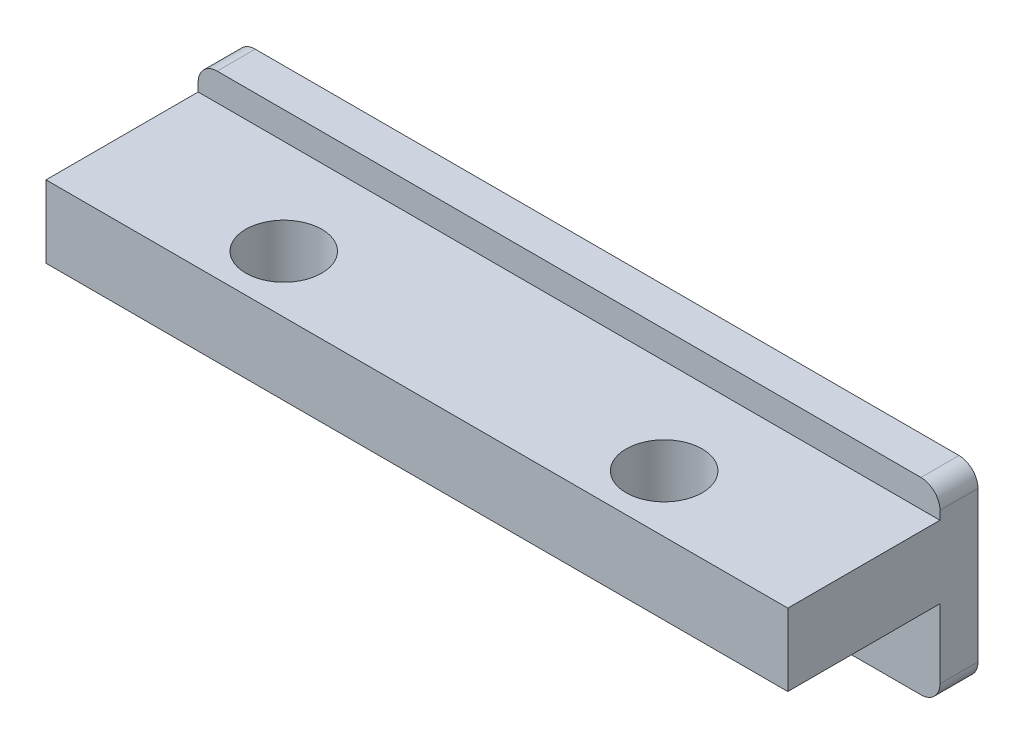
ISO-10303-21;
HEADER;
FILE_DESCRIPTION(('STEP AP214'),'2;1');
FILE_NAME('part.step','',(''),(''),'','','');
FILE_SCHEMA(('AUTOMOTIVE_DESIGN { 1 0 10303 214 1 1 1 1 }'));
ENDSEC;
DATA;
#1=APPLICATION_CONTEXT('core data for automotive mechanical design processes');
#2=APPLICATION_PROTOCOL_DEFINITION('international standard','automotive_design',2000,#1);
#3=PRODUCT_CONTEXT('',#1,'mechanical');
#4=PRODUCT('Part','Part','',(#3));
#5=PRODUCT_RELATED_PRODUCT_CATEGORY('part','',(#4));
#6=PRODUCT_DEFINITION_FORMATION('','',#4);
#7=PRODUCT_DEFINITION_CONTEXT('part definition',#1,'design');
#8=PRODUCT_DEFINITION('design','',#6,#7);
#9=PRODUCT_DEFINITION_SHAPE('','',#8);
#10=(LENGTH_UNIT() NAMED_UNIT(*) SI_UNIT(.MILLI.,.METRE.));
#11=(NAMED_UNIT(*) PLANE_ANGLE_UNIT() SI_UNIT($,.RADIAN.));
#12=(NAMED_UNIT(*) SI_UNIT($,.STERADIAN.) SOLID_ANGLE_UNIT());
#13=UNCERTAINTY_MEASURE_WITH_UNIT(LENGTH_MEASURE(1.E-05),#10,'distance_accuracy_value','');
#14=(GEOMETRIC_REPRESENTATION_CONTEXT(3) GLOBAL_UNCERTAINTY_ASSIGNED_CONTEXT((#13)) GLOBAL_UNIT_ASSIGNED_CONTEXT((#10,
#11,#12)) REPRESENTATION_CONTEXT('',''));
#15=CARTESIAN_POINT('',(0.,0.,0.));
#16=DIRECTION('',(0.,0.,1.));
#17=DIRECTION('',(1.,0.,0.));
#18=AXIS2_PLACEMENT_3D('',#15,#16,#17);
#19=CARTESIAN_POINT('',(0.,0.,2.));
#20=DIRECTION('',(0.,0.,1.));
#21=DIRECTION('',(1.,0.,0.));
#22=AXIS2_PLACEMENT_3D('',#19,#20,#21);
#23=PLANE('',#22);
#24=DIRECTION('',(0.,-1.,0.));
#25=VECTOR('',#24,1.);
#26=CARTESIAN_POINT('',(0.,0.,2.));
#27=LINE('',#26,#25);
#28=CARTESIAN_POINT('',(0.,1.64999999999999,2.));
#29=VERTEX_POINT('',#28);
#30=CARTESIAN_POINT('',(0.,-2.,2.));
#31=VERTEX_POINT('',#30);
#32=EDGE_CURVE('E210',#29,#31,#27,.T.);
#33=ORIENTED_EDGE('',*,*,#32,.T.);
#34=CARTESIAN_POINT('',(1.,-2.,2.));
#35=DIRECTION('',(0.,0.,1.));
#36=DIRECTION('',(1.,0.,0.));
#37=AXIS2_PLACEMENT_3D('',#34,#35,#36);
#38=CIRCLE('',#37,1.);
#39=CARTESIAN_POINT('',(1.,-3.,2.));
#40=VERTEX_POINT('',#39);
#41=EDGE_CURVE('E295',#31,#40,#38,.T.);
#42=ORIENTED_EDGE('',*,*,#41,.T.);
#43=DIRECTION('',(1.,0.,0.));
#44=VECTOR('',#43,1.);
#45=CARTESIAN_POINT('',(0.,-3.,2.));
#46=LINE('',#45,#44);
#47=CARTESIAN_POINT('',(9.,-3.,2.));
#48=VERTEX_POINT('',#47);
#49=EDGE_CURVE('E209',#40,#48,#46,.T.);
#50=ORIENTED_EDGE('',*,*,#49,.T.);
#51=CARTESIAN_POINT('',(9.,-2.,2.));
#52=DIRECTION('',(0.,0.,1.));
#53=DIRECTION('',(1.,0.,0.));
#54=AXIS2_PLACEMENT_3D('',#51,#52,#53);
#55=CIRCLE('',#54,1.);
#56=CARTESIAN_POINT('',(10.,-2.,2.));
#57=VERTEX_POINT('',#56);
#58=EDGE_CURVE('E293',#48,#57,#55,.T.);
#59=ORIENTED_EDGE('',*,*,#58,.T.);
#60=DIRECTION('',(0.,1.,0.));
#61=VECTOR('',#60,1.);
#62=CARTESIAN_POINT('',(10.,-3.,2.));
#63=LINE('',#62,#61);
#64=CARTESIAN_POINT('',(10.,-1.,2.));
#65=VERTEX_POINT('',#64);
#66=EDGE_CURVE('E213',#57,#65,#63,.T.);
#67=ORIENTED_EDGE('',*,*,#66,.T.);
#68=CARTESIAN_POINT('',(11.,-1.,2.));
#69=DIRECTION('',(0.,0.,1.));
#70=DIRECTION('',(1.,0.,0.));
#71=AXIS2_PLACEMENT_3D('',#68,#69,#70);
#72=CIRCLE('',#71,1.);
#73=CARTESIAN_POINT('',(11.,0.,2.));
#74=VERTEX_POINT('',#73);
#75=EDGE_CURVE('E318',#65,#74,#72,.F.);
#76=ORIENTED_EDGE('',*,*,#75,.T.);
#77=DIRECTION('',(1.,0.,0.));
#78=VECTOR('',#77,1.);
#79=CARTESIAN_POINT('',(10.,0.,2.));
#80=LINE('',#79,#78);
#81=CARTESIAN_POINT('',(28.,0.,2.));
#82=VERTEX_POINT('',#81);
#83=EDGE_CURVE('E216',#74,#82,#80,.T.);
#84=ORIENTED_EDGE('',*,*,#83,.T.);
#85=CARTESIAN_POINT('',(28.,-1.,2.));
#86=DIRECTION('',(0.,0.,1.));
#87=DIRECTION('',(1.,0.,0.));
#88=AXIS2_PLACEMENT_3D('',#85,#86,#87);
#89=CIRCLE('',#88,1.);
#90=CARTESIAN_POINT('',(29.,-1.,2.));
#91=VERTEX_POINT('',#90);
#92=EDGE_CURVE('E11',#82,#91,#89,.F.);
#93=ORIENTED_EDGE('',*,*,#92,.T.);
#94=DIRECTION('',(0.,-1.,0.));
#95=VECTOR('',#94,1.);
#96=CARTESIAN_POINT('',(29.,0.,2.));
#97=LINE('',#96,#95);
#98=CARTESIAN_POINT('',(29.,-2.,2.));
#99=VERTEX_POINT('',#98);
#100=EDGE_CURVE('E219',#91,#99,#97,.T.);
#101=ORIENTED_EDGE('',*,*,#100,.T.);
#102=CARTESIAN_POINT('',(30.,-2.,2.));
#103=DIRECTION('',(0.,0.,1.));
#104=DIRECTION('',(1.,0.,0.));
#105=AXIS2_PLACEMENT_3D('',#102,#103,#104);
#106=CIRCLE('',#105,1.);
#107=CARTESIAN_POINT('',(30.,-3.,2.));
#108=VERTEX_POINT('',#107);
#109=EDGE_CURVE('E55',#99,#108,#106,.T.);
#110=ORIENTED_EDGE('',*,*,#109,.T.);
#111=DIRECTION('',(1.,0.,0.));
#112=VECTOR('',#111,1.);
#113=CARTESIAN_POINT('',(29.,-3.,2.));
#114=LINE('',#113,#112);
#115=CARTESIAN_POINT('',(38.,-3.,2.));
#116=VERTEX_POINT('',#115);
#117=EDGE_CURVE('E221',#108,#116,#114,.T.);
#118=ORIENTED_EDGE('',*,*,#117,.T.);
#119=CARTESIAN_POINT('',(38.,-2.,2.));
#120=DIRECTION('',(0.,0.,1.));
#121=DIRECTION('',(1.,0.,0.));
#122=AXIS2_PLACEMENT_3D('',#119,#120,#121);
#123=CIRCLE('',#122,1.);
#124=CARTESIAN_POINT('',(39.,-2.,2.));
#125=VERTEX_POINT('',#124);
#126=EDGE_CURVE('E291',#116,#125,#123,.T.);
#127=ORIENTED_EDGE('',*,*,#126,.T.);
#128=DIRECTION('',(0.,1.,0.));
#129=VECTOR('',#128,1.);
#130=CARTESIAN_POINT('',(39.,-3.,2.));
#131=LINE('',#130,#129);
#132=CARTESIAN_POINT('',(39.,1.64999999999999,2.));
#133=VERTEX_POINT('',#132);
#134=EDGE_CURVE('E223',#125,#133,#131,.T.);
#135=ORIENTED_EDGE('',*,*,#134,.T.);
#136=DIRECTION('',(1.,0.,0.));
#137=VECTOR('',#136,1.);
#138=CARTESIAN_POINT('',(39.,1.65,2.));
#139=LINE('',#138,#137);
#140=EDGE_CURVE('E191',#29,#133,#139,.T.);
#141=ORIENTED_EDGE('',*,*,#140,.F.);
#142=EDGE_LOOP('',(#33,#42,#50,#59,#67,#76,#84,#93,#101,#110,#118,#127,#135,#141));
#143=FACE_BOUND('',#142,.T.);
#144=ADVANCED_FACE('F33',(#143),#23,.T.);
#145=CARTESIAN_POINT('',(0.,-3.,2.));
#146=DIRECTION('',(0.,1.,0.));
#147=DIRECTION('',(0.,0.,1.));
#148=AXIS2_PLACEMENT_3D('',#145,#146,#147);
#149=PLANE('',#148);
#150=ORIENTED_EDGE('',*,*,#49,.F.);
#151=DIRECTION('',(0.,0.,-1.));
#152=VECTOR('',#151,1.);
#153=CARTESIAN_POINT('',(1.,-3.,2.));
#154=LINE('',#153,#152);
#155=CARTESIAN_POINT('',(1.,-3.,0.));
#156=VERTEX_POINT('',#155);
#157=EDGE_CURVE('E287',#40,#156,#154,.T.);
#158=ORIENTED_EDGE('',*,*,#157,.T.);
#159=DIRECTION('',(1.,0.,0.));
#160=VECTOR('',#159,1.);
#161=CARTESIAN_POINT('',(0.,-3.,0.));
#162=LINE('',#161,#160);
#163=CARTESIAN_POINT('',(9.,-3.,0.));
#164=VERTEX_POINT('',#163);
#165=EDGE_CURVE('E198',#156,#164,#162,.T.);
#166=ORIENTED_EDGE('',*,*,#165,.T.);
#167=DIRECTION('',(0.,0.,-1.));
#168=VECTOR('',#167,1.);
#169=CARTESIAN_POINT('',(9.,-3.,2.));
#170=LINE('',#169,#168);
#171=EDGE_CURVE('E285',#164,#48,#170,.F.);
#172=ORIENTED_EDGE('',*,*,#171,.T.);
#173=EDGE_LOOP('',(#150,#158,#166,#172));
#174=FACE_BOUND('',#173,.T.);
#175=ADVANCED_FACE('F387',(#174),#149,.F.);
#176=CARTESIAN_POINT('',(10.,-3.,2.));
#177=DIRECTION('',(-1.,0.,0.));
#178=DIRECTION('',(0.,0.,1.));
#179=AXIS2_PLACEMENT_3D('',#176,#177,#178);
#180=PLANE('',#179);
#181=ORIENTED_EDGE('',*,*,#66,.F.);
#182=DIRECTION('',(0.,0.,-1.));
#183=VECTOR('',#182,1.);
#184=CARTESIAN_POINT('',(10.,-2.,2.));
#185=LINE('',#184,#183);
#186=CARTESIAN_POINT('',(10.,-2.,0.));
#187=VERTEX_POINT('',#186);
#188=EDGE_CURVE('E299',#57,#187,#185,.T.);
#189=ORIENTED_EDGE('',*,*,#188,.T.);
#190=DIRECTION('',(0.,1.,0.));
#191=VECTOR('',#190,1.);
#192=CARTESIAN_POINT('',(10.,-3.,0.));
#193=LINE('',#192,#191);
#194=CARTESIAN_POINT('',(10.,-1.,0.));
#195=VERTEX_POINT('',#194);
#196=EDGE_CURVE('E201',#187,#195,#193,.T.);
#197=ORIENTED_EDGE('',*,*,#196,.T.);
#198=DIRECTION('',(0.,0.,-1.));
#199=VECTOR('',#198,1.);
#200=CARTESIAN_POINT('',(10.,-1.,2.));
#201=LINE('',#200,#199);
#202=EDGE_CURVE('E297',#195,#65,#201,.F.);
#203=ORIENTED_EDGE('',*,*,#202,.T.);
#204=EDGE_LOOP('',(#181,#189,#197,#203));
#205=FACE_BOUND('',#204,.T.);
#206=ADVANCED_FACE('F393',(#205),#180,.F.);
#207=CARTESIAN_POINT('',(10.,0.,2.));
#208=DIRECTION('',(0.,1.,0.));
#209=DIRECTION('',(0.,0.,1.));
#210=AXIS2_PLACEMENT_3D('',#207,#208,#209);
#211=PLANE('',#210);
#212=ORIENTED_EDGE('',*,*,#83,.F.);
#213=DIRECTION('',(0.,0.,-1.));
#214=VECTOR('',#213,1.);
#215=CARTESIAN_POINT('',(11.,0.,0.));
#216=LINE('',#215,#214);
#217=CARTESIAN_POINT('',(11.,0.,0.));
#218=VERTEX_POINT('',#217);
#219=EDGE_CURVE('E304',#74,#218,#216,.T.);
#220=ORIENTED_EDGE('',*,*,#219,.T.);
#221=DIRECTION('',(1.,0.,0.));
#222=VECTOR('',#221,1.);
#223=CARTESIAN_POINT('',(10.,0.,0.));
#224=LINE('',#223,#222);
#225=CARTESIAN_POINT('',(28.,0.,0.));
#226=VERTEX_POINT('',#225);
#227=EDGE_CURVE('E231',#218,#226,#224,.T.);
#228=ORIENTED_EDGE('',*,*,#227,.T.);
#229=DIRECTION('',(0.,0.,-1.));
#230=VECTOR('',#229,1.);
#231=CARTESIAN_POINT('',(28.,0.,2.));
#232=LINE('',#231,#230);
#233=EDGE_CURVE('E302',#226,#82,#232,.F.);
#234=ORIENTED_EDGE('',*,*,#233,.T.);
#235=EDGE_LOOP('',(#212,#220,#228,#234));
#236=FACE_BOUND('',#235,.T.);
#237=ADVANCED_FACE('F329',(#236),#211,.F.);
#238=CARTESIAN_POINT('',(29.,0.,2.));
#239=DIRECTION('',(1.,0.,0.));
#240=DIRECTION('',(0.,0.,-1.));
#241=AXIS2_PLACEMENT_3D('',#238,#239,#240);
#242=PLANE('',#241);
#243=DIRECTION('',(0.,-1.,0.));
#244=VECTOR('',#243,1.);
#245=CARTESIAN_POINT('',(29.,0.,0.));
#246=LINE('',#245,#244);
#247=CARTESIAN_POINT('',(29.,-1.,0.));
#248=VERTEX_POINT('',#247);
#249=CARTESIAN_POINT('',(29.,-2.,0.));
#250=VERTEX_POINT('',#249);
#251=EDGE_CURVE('E234',#248,#250,#246,.T.);
#252=ORIENTED_EDGE('',*,*,#251,.T.);
#253=DIRECTION('',(0.,0.,-1.));
#254=VECTOR('',#253,1.);
#255=CARTESIAN_POINT('',(29.,-2.,2.));
#256=LINE('',#255,#254);
#257=EDGE_CURVE('E314',#250,#99,#256,.F.);
#258=ORIENTED_EDGE('',*,*,#257,.T.);
#259=ORIENTED_EDGE('',*,*,#100,.F.);
#260=DIRECTION('',(0.,0.,-1.));
#261=VECTOR('',#260,1.);
#262=CARTESIAN_POINT('',(29.,-1.,0.));
#263=LINE('',#262,#261);
#264=EDGE_CURVE('E311',#91,#248,#263,.T.);
#265=ORIENTED_EDGE('',*,*,#264,.T.);
#266=EDGE_LOOP('',(#252,#258,#259,#265));
#267=FACE_BOUND('',#266,.T.);
#268=ADVANCED_FACE('F335',(#267),#242,.F.);
#269=CARTESIAN_POINT('',(29.,-3.,2.));
#270=DIRECTION('',(0.,1.,0.));
#271=DIRECTION('',(0.,0.,1.));
#272=AXIS2_PLACEMENT_3D('',#269,#270,#271);
#273=PLANE('',#272);
#274=DIRECTION('',(1.,0.,0.));
#275=VECTOR('',#274,1.);
#276=CARTESIAN_POINT('',(29.,-3.,0.));
#277=LINE('',#276,#275);
#278=CARTESIAN_POINT('',(30.,-3.,0.));
#279=VERTEX_POINT('',#278);
#280=CARTESIAN_POINT('',(38.,-3.,0.));
#281=VERTEX_POINT('',#280);
#282=EDGE_CURVE('E237',#279,#281,#277,.T.);
#283=ORIENTED_EDGE('',*,*,#282,.T.);
#284=DIRECTION('',(0.,0.,-1.));
#285=VECTOR('',#284,1.);
#286=CARTESIAN_POINT('',(38.,-3.,2.));
#287=LINE('',#286,#285);
#288=EDGE_CURVE('E48',#281,#116,#287,.F.);
#289=ORIENTED_EDGE('',*,*,#288,.T.);
#290=ORIENTED_EDGE('',*,*,#117,.F.);
#291=DIRECTION('',(0.,0.,-1.));
#292=VECTOR('',#291,1.);
#293=CARTESIAN_POINT('',(30.,-3.,2.));
#294=LINE('',#293,#292);
#295=EDGE_CURVE('E307',#108,#279,#294,.T.);
#296=ORIENTED_EDGE('',*,*,#295,.T.);
#297=EDGE_LOOP('',(#283,#289,#290,#296));
#298=FACE_BOUND('',#297,.T.);
#299=ADVANCED_FACE('F341',(#298),#273,.F.);
#300=CARTESIAN_POINT('',(39.,0.,2.));
#301=DIRECTION('',(-1.,0.,0.));
#302=DIRECTION('',(0.,0.,1.));
#303=AXIS2_PLACEMENT_3D('',#300,#301,#302);
#304=PLANE('',#303);
#305=DIRECTION('',(0.,1.,0.));
#306=VECTOR('',#305,1.);
#307=CARTESIAN_POINT('',(39.,0.,0.));
#308=LINE('',#307,#306);
#309=CARTESIAN_POINT('',(39.,-2.,0.));
#310=VERTEX_POINT('',#309);
#311=CARTESIAN_POINT('',(39.,5.9,0.));
#312=VERTEX_POINT('',#311);
#313=EDGE_CURVE('E239',#310,#312,#308,.T.);
#314=ORIENTED_EDGE('',*,*,#313,.T.);
#315=DIRECTION('',(0.,0.,-1.));
#316=VECTOR('',#315,1.);
#317=CARTESIAN_POINT('',(39.,5.9,2.));
#318=LINE('',#317,#316);
#319=CARTESIAN_POINT('',(39.,5.9,2.));
#320=VERTEX_POINT('',#319);
#321=EDGE_CURVE('E274',#312,#320,#318,.F.);
#322=ORIENTED_EDGE('',*,*,#321,.T.);
#323=CARTESIAN_POINT('',(39.,5.45,2.));
#324=VERTEX_POINT('',#323);
#325=EDGE_CURVE('E197',#324,#320,#131,.T.);
#326=ORIENTED_EDGE('',*,*,#325,.F.);
#327=DIRECTION('',(0.,0.,-1.));
#328=VECTOR('',#327,1.);
#329=CARTESIAN_POINT('',(39.,5.45,10.));
#330=LINE('',#329,#328);
#331=CARTESIAN_POINT('',(39.,5.45,10.));
#332=VERTEX_POINT('',#331);
#333=EDGE_CURVE('E176',#332,#324,#330,.T.);
#334=ORIENTED_EDGE('',*,*,#333,.F.);
#335=DIRECTION('',(0.,1.,0.));
#336=VECTOR('',#335,1.);
#337=CARTESIAN_POINT('',(39.,5.45,10.));
#338=LINE('',#337,#336);
#339=CARTESIAN_POINT('',(39.,1.65,10.));
#340=VERTEX_POINT('',#339);
#341=EDGE_CURVE('E182',#340,#332,#338,.T.);
#342=ORIENTED_EDGE('',*,*,#341,.F.);
#343=DIRECTION('',(0.,0.,-1.));
#344=VECTOR('',#343,1.);
#345=CARTESIAN_POINT('',(39.,1.65,10.));
#346=LINE('',#345,#344);
#347=EDGE_CURVE('E349',#340,#133,#346,.T.);
#348=ORIENTED_EDGE('',*,*,#347,.T.);
#349=ORIENTED_EDGE('',*,*,#134,.F.);
#350=DIRECTION('',(0.,0.,-1.));
#351=VECTOR('',#350,1.);
#352=CARTESIAN_POINT('',(39.,-2.,2.));
#353=LINE('',#352,#351);
#354=EDGE_CURVE('E271',#125,#310,#353,.T.);
#355=ORIENTED_EDGE('',*,*,#354,.T.);
#356=EDGE_LOOP('',(#314,#322,#326,#334,#342,#348,#349,#355));
#357=FACE_BOUND('',#356,.T.);
#358=ADVANCED_FACE('F195',(#357),#304,.F.);
#359=CARTESIAN_POINT('',(0.,6.9,2.));
#360=DIRECTION('',(0.,-1.,0.));
#361=DIRECTION('',(0.,0.,-1.));
#362=AXIS2_PLACEMENT_3D('',#359,#360,#361);
#363=PLANE('',#362);
#364=DIRECTION('',(-1.,0.,0.));
#365=VECTOR('',#364,1.);
#366=CARTESIAN_POINT('',(0.,6.9,2.));
#367=LINE('',#366,#365);
#368=CARTESIAN_POINT('',(38.,6.9,2.));
#369=VERTEX_POINT('',#368);
#370=CARTESIAN_POINT('',(1.,6.9,2.));
#371=VERTEX_POINT('',#370);
#372=EDGE_CURVE('E225',#369,#371,#367,.T.);
#373=ORIENTED_EDGE('',*,*,#372,.F.);
#374=DIRECTION('',(0.,0.,-1.));
#375=VECTOR('',#374,1.);
#376=CARTESIAN_POINT('',(38.,6.9,2.));
#377=LINE('',#376,#375);
#378=CARTESIAN_POINT('',(38.,6.9,0.));
#379=VERTEX_POINT('',#378);
#380=EDGE_CURVE('E256',#369,#379,#377,.T.);
#381=ORIENTED_EDGE('',*,*,#380,.T.);
#382=DIRECTION('',(-1.,0.,0.));
#383=VECTOR('',#382,1.);
#384=CARTESIAN_POINT('',(0.,6.9,0.));
#385=LINE('',#384,#383);
#386=CARTESIAN_POINT('',(1.,6.9,0.));
#387=VERTEX_POINT('',#386);
#388=EDGE_CURVE('E241',#379,#387,#385,.T.);
#389=ORIENTED_EDGE('',*,*,#388,.T.);
#390=DIRECTION('',(0.,0.,-1.));
#391=VECTOR('',#390,1.);
#392=CARTESIAN_POINT('',(1.,6.9,2.));
#393=LINE('',#392,#391);
#394=EDGE_CURVE('E227',#387,#371,#393,.F.);
#395=ORIENTED_EDGE('',*,*,#394,.T.);
#396=EDGE_LOOP('',(#373,#381,#389,#395));
#397=FACE_BOUND('',#396,.T.);
#398=ADVANCED_FACE('F405',(#397),#363,.F.);
#399=CARTESIAN_POINT('',(0.,0.,2.));
#400=DIRECTION('',(1.,0.,0.));
#401=DIRECTION('',(0.,0.,-1.));
#402=AXIS2_PLACEMENT_3D('',#399,#400,#401);
#403=PLANE('',#402);
#404=CARTESIAN_POINT('',(0.,5.9,2.));
#405=VERTEX_POINT('',#404);
#406=CARTESIAN_POINT('',(0.,5.45,2.));
#407=VERTEX_POINT('',#406);
#408=EDGE_CURVE('E207',#405,#407,#27,.T.);
#409=ORIENTED_EDGE('',*,*,#408,.F.);
#410=DIRECTION('',(0.,0.,-1.));
#411=VECTOR('',#410,1.);
#412=CARTESIAN_POINT('',(0.,5.9,2.));
#413=LINE('',#412,#411);
#414=CARTESIAN_POINT('',(0.,5.9,0.));
#415=VERTEX_POINT('',#414);
#416=EDGE_CURVE('E282',#405,#415,#413,.T.);
#417=ORIENTED_EDGE('',*,*,#416,.T.);
#418=DIRECTION('',(0.,-1.,0.));
#419=VECTOR('',#418,1.);
#420=CARTESIAN_POINT('',(0.,0.,0.));
#421=LINE('',#420,#419);
#422=CARTESIAN_POINT('',(0.,-2.,0.));
#423=VERTEX_POINT('',#422);
#424=EDGE_CURVE('E244',#415,#423,#421,.T.);
#425=ORIENTED_EDGE('',*,*,#424,.T.);
#426=DIRECTION('',(0.,0.,-1.));
#427=VECTOR('',#426,1.);
#428=CARTESIAN_POINT('',(0.,-2.,2.));
#429=LINE('',#428,#427);
#430=EDGE_CURVE('E280',#423,#31,#429,.F.);
#431=ORIENTED_EDGE('',*,*,#430,.T.);
#432=ORIENTED_EDGE('',*,*,#32,.F.);
#433=DIRECTION('',(0.,0.,-1.));
#434=VECTOR('',#433,1.);
#435=CARTESIAN_POINT('',(0.,1.64999999999999,10.));
#436=LINE('',#435,#434);
#437=CARTESIAN_POINT('',(0.,1.64999999999999,10.));
#438=VERTEX_POINT('',#437);
#439=EDGE_CURVE('E203',#438,#29,#436,.T.);
#440=ORIENTED_EDGE('',*,*,#439,.F.);
#441=DIRECTION('',(0.,-1.,0.));
#442=VECTOR('',#441,1.);
#443=CARTESIAN_POINT('',(0.,5.45,10.));
#444=LINE('',#443,#442);
#445=CARTESIAN_POINT('',(0.,5.45,10.));
#446=VERTEX_POINT('',#445);
#447=EDGE_CURVE('E181',#446,#438,#444,.T.);
#448=ORIENTED_EDGE('',*,*,#447,.F.);
#449=DIRECTION('',(0.,0.,-1.));
#450=VECTOR('',#449,1.);
#451=CARTESIAN_POINT('',(0.,5.45,10.));
#452=LINE('',#451,#450);
#453=EDGE_CURVE('E178',#446,#407,#452,.T.);
#454=ORIENTED_EDGE('',*,*,#453,.T.);
#455=EDGE_LOOP('',(#409,#417,#425,#431,#432,#440,#448,#454));
#456=FACE_BOUND('',#455,.T.);
#457=ADVANCED_FACE('F399',(#456),#403,.F.);
#458=ORIENTED_EDGE('',*,*,#325,.T.);
#459=CARTESIAN_POINT('',(38.,5.9,2.));
#460=DIRECTION('',(0.,0.,1.));
#461=DIRECTION('',(1.,0.,0.));
#462=AXIS2_PLACEMENT_3D('',#459,#460,#461);
#463=CIRCLE('',#462,1.);
#464=EDGE_CURVE('E278',#320,#369,#463,.T.);
#465=ORIENTED_EDGE('',*,*,#464,.T.);
#466=ORIENTED_EDGE('',*,*,#372,.T.);
#467=CARTESIAN_POINT('',(1.,5.9,2.));
#468=DIRECTION('',(0.,0.,1.));
#469=DIRECTION('',(1.,0.,0.));
#470=AXIS2_PLACEMENT_3D('',#467,#468,#469);
#471=CIRCLE('',#470,1.);
#472=EDGE_CURVE('E276',#371,#405,#471,.T.);
#473=ORIENTED_EDGE('',*,*,#472,.T.);
#474=ORIENTED_EDGE('',*,*,#408,.T.);
#475=DIRECTION('',(-1.,0.,0.));
#476=VECTOR('',#475,1.);
#477=CARTESIAN_POINT('',(39.,5.45,2.));
#478=LINE('',#477,#476);
#479=EDGE_CURVE('E356',#324,#407,#478,.T.);
#480=ORIENTED_EDGE('',*,*,#479,.F.);
#481=EDGE_LOOP('',(#458,#465,#466,#473,#474,#480));
#482=FACE_BOUND('',#481,.T.);
#483=ADVANCED_FACE('F389',(#482),#23,.T.);
#484=CARTESIAN_POINT('',(0.,0.,0.));
#485=DIRECTION('',(0.,0.,1.));
#486=DIRECTION('',(1.,0.,0.));
#487=AXIS2_PLACEMENT_3D('',#484,#485,#486);
#488=PLANE('',#487);
#489=ORIENTED_EDGE('',*,*,#388,.F.);
#490=CARTESIAN_POINT('',(38.,5.9,0.));
#491=DIRECTION('',(0.,0.,1.));
#492=DIRECTION('',(1.,0.,0.));
#493=AXIS2_PLACEMENT_3D('',#490,#491,#492);
#494=CIRCLE('',#493,1.);
#495=EDGE_CURVE('E269',#379,#312,#494,.F.);
#496=ORIENTED_EDGE('',*,*,#495,.T.);
#497=ORIENTED_EDGE('',*,*,#313,.F.);
#498=CARTESIAN_POINT('',(38.,-2.,0.));
#499=DIRECTION('',(0.,0.,1.));
#500=DIRECTION('',(1.,0.,0.));
#501=AXIS2_PLACEMENT_3D('',#498,#499,#500);
#502=CIRCLE('',#501,1.);
#503=EDGE_CURVE('E261',#310,#281,#502,.F.);
#504=ORIENTED_EDGE('',*,*,#503,.T.);
#505=ORIENTED_EDGE('',*,*,#282,.F.);
#506=CARTESIAN_POINT('',(30.,-2.,0.));
#507=DIRECTION('',(0.,0.,1.));
#508=DIRECTION('',(1.,0.,0.));
#509=AXIS2_PLACEMENT_3D('',#506,#507,#508);
#510=CIRCLE('',#509,1.);
#511=EDGE_CURVE('E259',#279,#250,#510,.F.);
#512=ORIENTED_EDGE('',*,*,#511,.T.);
#513=ORIENTED_EDGE('',*,*,#251,.F.);
#514=CARTESIAN_POINT('',(28.,-1.,0.));
#515=DIRECTION('',(0.,0.,1.));
#516=DIRECTION('',(1.,0.,0.));
#517=AXIS2_PLACEMENT_3D('',#514,#515,#516);
#518=CIRCLE('',#517,1.);
#519=EDGE_CURVE('E41',#248,#226,#518,.T.);
#520=ORIENTED_EDGE('',*,*,#519,.T.);
#521=ORIENTED_EDGE('',*,*,#227,.F.);
#522=CARTESIAN_POINT('',(11.,-1.,0.));
#523=DIRECTION('',(0.,0.,1.));
#524=DIRECTION('',(1.,0.,0.));
#525=AXIS2_PLACEMENT_3D('',#522,#523,#524);
#526=CIRCLE('',#525,1.);
#527=EDGE_CURVE('E316',#218,#195,#526,.T.);
#528=ORIENTED_EDGE('',*,*,#527,.T.);
#529=ORIENTED_EDGE('',*,*,#196,.F.);
#530=CARTESIAN_POINT('',(9.,-2.,0.));
#531=DIRECTION('',(0.,0.,1.));
#532=DIRECTION('',(1.,0.,0.));
#533=AXIS2_PLACEMENT_3D('',#530,#531,#532);
#534=CIRCLE('',#533,1.);
#535=EDGE_CURVE('E263',#187,#164,#534,.F.);
#536=ORIENTED_EDGE('',*,*,#535,.T.);
#537=ORIENTED_EDGE('',*,*,#165,.F.);
#538=CARTESIAN_POINT('',(1.,-2.,0.));
#539=DIRECTION('',(0.,0.,1.));
#540=DIRECTION('',(1.,0.,0.));
#541=AXIS2_PLACEMENT_3D('',#538,#539,#540);
#542=CIRCLE('',#541,1.);
#543=EDGE_CURVE('E265',#156,#423,#542,.F.);
#544=ORIENTED_EDGE('',*,*,#543,.T.);
#545=ORIENTED_EDGE('',*,*,#424,.F.);
#546=CARTESIAN_POINT('',(1.,5.9,0.));
#547=DIRECTION('',(0.,0.,1.));
#548=DIRECTION('',(1.,0.,0.));
#549=AXIS2_PLACEMENT_3D('',#546,#547,#548);
#550=CIRCLE('',#549,1.);
#551=EDGE_CURVE('E267',#415,#387,#550,.F.);
#552=ORIENTED_EDGE('',*,*,#551,.T.);
#553=EDGE_LOOP('',(#489,#496,#497,#504,#505,#512,#513,#520,#521,#528,#529,#536,#537,#544,#545,#552));
#554=FACE_BOUND('',#553,.T.);
#555=ADVANCED_FACE('F323',(#554),#488,.F.);
#556=CARTESIAN_POINT('',(39.,5.45,10.));
#557=DIRECTION('',(0.,-1.,0.));
#558=DIRECTION('',(1.,0.,0.));
#559=AXIS2_PLACEMENT_3D('',#556,#557,#558);
#560=PLANE('',#559);
#561=CARTESIAN_POINT('',(29.5,5.45,7.));
#562=DIRECTION('',(0.,-1.,0.));
#563=DIRECTION('',(1.,0.,0.));
#564=AXIS2_PLACEMENT_3D('',#561,#562,#563);
#565=CIRCLE('',#564,2.00000000000001);
#566=CARTESIAN_POINT('',(31.5,5.45,7.));
#567=VERTEX_POINT('',#566);
#568=EDGE_CURVE('E251',#567,#567,#565,.T.);
#569=ORIENTED_EDGE('',*,*,#568,.T.);
#570=EDGE_LOOP('',(#569));
#571=FACE_BOUND('',#570,.T.);
#572=CARTESIAN_POINT('',(9.5,5.45,7.));
#573=DIRECTION('',(0.,-1.,0.));
#574=DIRECTION('',(1.,0.,0.));
#575=AXIS2_PLACEMENT_3D('',#572,#573,#574);
#576=CIRCLE('',#575,2.);
#577=CARTESIAN_POINT('',(11.5,5.45,7.));
#578=VERTEX_POINT('',#577);
#579=EDGE_CURVE('E250',#578,#578,#576,.T.);
#580=ORIENTED_EDGE('',*,*,#579,.T.);
#581=EDGE_LOOP('',(#580));
#582=FACE_BOUND('',#581,.T.);
#583=ORIENTED_EDGE('',*,*,#479,.T.);
#584=ORIENTED_EDGE('',*,*,#453,.F.);
#585=DIRECTION('',(-1.,0.,0.));
#586=VECTOR('',#585,1.);
#587=CARTESIAN_POINT('',(39.,5.45,10.));
#588=LINE('',#587,#586);
#589=EDGE_CURVE('E171',#332,#446,#588,.T.);
#590=ORIENTED_EDGE('',*,*,#589,.F.);
#591=ORIENTED_EDGE('',*,*,#333,.T.);
#592=EDGE_LOOP('',(#583,#584,#590,#591));
#593=FACE_BOUND('',#592,.T.);
#594=ADVANCED_FACE('F174',(#571,#582,#593),#560,.F.);
#595=CARTESIAN_POINT('',(39.,1.65,10.));
#596=DIRECTION('',(0.,1.,0.));
#597=DIRECTION('',(-1.,0.,0.));
#598=AXIS2_PLACEMENT_3D('',#595,#596,#597);
#599=PLANE('',#598);
#600=CARTESIAN_POINT('',(29.5,1.65,7.));
#601=DIRECTION('',(0.,1.,0.));
#602=DIRECTION('',(-1.,0.,0.));
#603=AXIS2_PLACEMENT_3D('',#600,#601,#602);
#604=CIRCLE('',#603,2.00000000000001);
#605=CARTESIAN_POINT('',(27.5,1.65,7.));
#606=VERTEX_POINT('',#605);
#607=EDGE_CURVE('E252',#606,#606,#604,.T.);
#608=ORIENTED_EDGE('',*,*,#607,.T.);
#609=EDGE_LOOP('',(#608));
#610=FACE_BOUND('',#609,.T.);
#611=CARTESIAN_POINT('',(9.5,1.64999999999999,7.));
#612=DIRECTION('',(0.,1.,0.));
#613=DIRECTION('',(-1.,0.,0.));
#614=AXIS2_PLACEMENT_3D('',#611,#612,#613);
#615=CIRCLE('',#614,2.);
#616=CARTESIAN_POINT('',(7.5,1.64999999999999,7.));
#617=VERTEX_POINT('',#616);
#618=EDGE_CURVE('E247',#617,#617,#615,.T.);
#619=ORIENTED_EDGE('',*,*,#618,.T.);
#620=EDGE_LOOP('',(#619));
#621=FACE_BOUND('',#620,.T.);
#622=ORIENTED_EDGE('',*,*,#140,.T.);
#623=ORIENTED_EDGE('',*,*,#347,.F.);
#624=DIRECTION('',(1.,0.,0.));
#625=VECTOR('',#624,1.);
#626=CARTESIAN_POINT('',(39.,1.65,10.));
#627=LINE('',#626,#625);
#628=EDGE_CURVE('E187',#438,#340,#627,.T.);
#629=ORIENTED_EDGE('',*,*,#628,.F.);
#630=ORIENTED_EDGE('',*,*,#439,.T.);
#631=EDGE_LOOP('',(#622,#623,#629,#630));
#632=FACE_BOUND('',#631,.T.);
#633=ADVANCED_FACE('F354',(#610,#621,#632),#599,.F.);
#634=CARTESIAN_POINT('',(0.,0.,10.));
#635=DIRECTION('',(0.,0.,-1.));
#636=DIRECTION('',(-1.,0.,0.));
#637=AXIS2_PLACEMENT_3D('',#634,#635,#636);
#638=PLANE('',#637);
#639=ORIENTED_EDGE('',*,*,#341,.T.);
#640=ORIENTED_EDGE('',*,*,#589,.T.);
#641=ORIENTED_EDGE('',*,*,#447,.T.);
#642=ORIENTED_EDGE('',*,*,#628,.T.);
#643=EDGE_LOOP('',(#639,#640,#641,#642));
#644=FACE_BOUND('',#643,.T.);
#645=ADVANCED_FACE('F185',(#644),#638,.F.);
#646=CARTESIAN_POINT('',(9.5,-3.,7.));
#647=DIRECTION('',(0.,1.,0.));
#648=DIRECTION('',(-1.,0.,0.));
#649=AXIS2_PLACEMENT_3D('',#646,#647,#648);
#650=CYLINDRICAL_SURFACE('',#649,2.);
#651=ORIENTED_EDGE('',*,*,#618,.F.);
#652=EDGE_LOOP('',(#651));
#653=FACE_BOUND('',#652,.T.);
#654=ORIENTED_EDGE('',*,*,#579,.F.);
#655=EDGE_LOOP('',(#654));
#656=FACE_BOUND('',#655,.T.);
#657=ADVANCED_FACE('F373',(#653,#656),#650,.F.);
#658=CARTESIAN_POINT('',(29.5,-3.,7.));
#659=DIRECTION('',(0.,1.,0.));
#660=DIRECTION('',(-1.,0.,0.));
#661=AXIS2_PLACEMENT_3D('',#658,#659,#660);
#662=CYLINDRICAL_SURFACE('',#661,2.00000000000001);
#663=ORIENTED_EDGE('',*,*,#607,.F.);
#664=EDGE_LOOP('',(#663));
#665=FACE_BOUND('',#664,.T.);
#666=ORIENTED_EDGE('',*,*,#568,.F.);
#667=EDGE_LOOP('',(#666));
#668=FACE_BOUND('',#667,.T.);
#669=ADVANCED_FACE('F370',(#665,#668),#662,.F.);
#670=CARTESIAN_POINT('',(38.,5.9,2.));
#671=DIRECTION('',(0.,0.,-1.));
#672=DIRECTION('',(-1.,0.,0.));
#673=AXIS2_PLACEMENT_3D('',#670,#671,#672);
#674=CYLINDRICAL_SURFACE('',#673,1.);
#675=ORIENTED_EDGE('',*,*,#464,.F.);
#676=ORIENTED_EDGE('',*,*,#321,.F.);
#677=ORIENTED_EDGE('',*,*,#495,.F.);
#678=ORIENTED_EDGE('',*,*,#380,.F.);
#679=EDGE_LOOP('',(#675,#676,#677,#678));
#680=FACE_BOUND('',#679,.T.);
#681=ADVANCED_FACE('F372',(#680),#674,.T.);
#682=CARTESIAN_POINT('',(1.,5.9,2.));
#683=DIRECTION('',(0.,0.,-1.));
#684=DIRECTION('',(-1.,0.,0.));
#685=AXIS2_PLACEMENT_3D('',#682,#683,#684);
#686=CYLINDRICAL_SURFACE('',#685,1.);
#687=ORIENTED_EDGE('',*,*,#472,.F.);
#688=ORIENTED_EDGE('',*,*,#394,.F.);
#689=ORIENTED_EDGE('',*,*,#551,.F.);
#690=ORIENTED_EDGE('',*,*,#416,.F.);
#691=EDGE_LOOP('',(#687,#688,#689,#690));
#692=FACE_BOUND('',#691,.T.);
#693=ADVANCED_FACE('F380',(#692),#686,.T.);
#694=CARTESIAN_POINT('',(1.,-2.,2.));
#695=DIRECTION('',(0.,0.,-1.));
#696=DIRECTION('',(-1.,0.,0.));
#697=AXIS2_PLACEMENT_3D('',#694,#695,#696);
#698=CYLINDRICAL_SURFACE('',#697,1.);
#699=ORIENTED_EDGE('',*,*,#41,.F.);
#700=ORIENTED_EDGE('',*,*,#430,.F.);
#701=ORIENTED_EDGE('',*,*,#543,.F.);
#702=ORIENTED_EDGE('',*,*,#157,.F.);
#703=EDGE_LOOP('',(#699,#700,#701,#702));
#704=FACE_BOUND('',#703,.T.);
#705=ADVANCED_FACE('F423',(#704),#698,.T.);
#706=CARTESIAN_POINT('',(9.,-2.,2.));
#707=DIRECTION('',(0.,0.,-1.));
#708=DIRECTION('',(-1.,0.,0.));
#709=AXIS2_PLACEMENT_3D('',#706,#707,#708);
#710=CYLINDRICAL_SURFACE('',#709,1.);
#711=ORIENTED_EDGE('',*,*,#58,.F.);
#712=ORIENTED_EDGE('',*,*,#171,.F.);
#713=ORIENTED_EDGE('',*,*,#535,.F.);
#714=ORIENTED_EDGE('',*,*,#188,.F.);
#715=EDGE_LOOP('',(#711,#712,#713,#714));
#716=FACE_BOUND('',#715,.T.);
#717=ADVANCED_FACE('F430',(#716),#710,.T.);
#718=CARTESIAN_POINT('',(11.,-1.,2.));
#719=DIRECTION('',(0.,0.,1.));
#720=DIRECTION('',(1.,0.,0.));
#721=AXIS2_PLACEMENT_3D('',#718,#719,#720);
#722=CYLINDRICAL_SURFACE('',#721,1.);
#723=ORIENTED_EDGE('',*,*,#75,.F.);
#724=ORIENTED_EDGE('',*,*,#202,.F.);
#725=ORIENTED_EDGE('',*,*,#527,.F.);
#726=ORIENTED_EDGE('',*,*,#219,.F.);
#727=EDGE_LOOP('',(#723,#724,#725,#726));
#728=FACE_BOUND('',#727,.T.);
#729=ADVANCED_FACE('F436',(#728),#722,.F.);
#730=CARTESIAN_POINT('',(38.,-2.,2.));
#731=DIRECTION('',(0.,0.,-1.));
#732=DIRECTION('',(-1.,0.,0.));
#733=AXIS2_PLACEMENT_3D('',#730,#731,#732);
#734=CYLINDRICAL_SURFACE('',#733,1.);
#735=ORIENTED_EDGE('',*,*,#126,.F.);
#736=ORIENTED_EDGE('',*,*,#288,.F.);
#737=ORIENTED_EDGE('',*,*,#503,.F.);
#738=ORIENTED_EDGE('',*,*,#354,.F.);
#739=EDGE_LOOP('',(#735,#736,#737,#738));
#740=FACE_BOUND('',#739,.T.);
#741=ADVANCED_FACE('F346',(#740),#734,.T.);
#742=CARTESIAN_POINT('',(30.,-2.,2.));
#743=DIRECTION('',(0.,0.,-1.));
#744=DIRECTION('',(-1.,0.,0.));
#745=AXIS2_PLACEMENT_3D('',#742,#743,#744);
#746=CYLINDRICAL_SURFACE('',#745,1.);
#747=ORIENTED_EDGE('',*,*,#109,.F.);
#748=ORIENTED_EDGE('',*,*,#257,.F.);
#749=ORIENTED_EDGE('',*,*,#511,.F.);
#750=ORIENTED_EDGE('',*,*,#295,.F.);
#751=EDGE_LOOP('',(#747,#748,#749,#750));
#752=FACE_BOUND('',#751,.T.);
#753=ADVANCED_FACE('F338',(#752),#746,.T.);
#754=CARTESIAN_POINT('',(28.,-1.,2.));
#755=DIRECTION('',(0.,0.,1.));
#756=DIRECTION('',(1.,0.,0.));
#757=AXIS2_PLACEMENT_3D('',#754,#755,#756);
#758=CYLINDRICAL_SURFACE('',#757,1.);
#759=ORIENTED_EDGE('',*,*,#92,.F.);
#760=ORIENTED_EDGE('',*,*,#233,.F.);
#761=ORIENTED_EDGE('',*,*,#519,.F.);
#762=ORIENTED_EDGE('',*,*,#264,.F.);
#763=EDGE_LOOP('',(#759,#760,#761,#762));
#764=FACE_BOUND('',#763,.T.);
#765=ADVANCED_FACE('F35',(#764),#758,.F.);
#766=CLOSED_SHELL('',(#144,#175,#206,#237,#268,#299,#358,#398,#457,#483,#555,#594,#633,#645,
#657,#669,#681,#693,#705,#717,#729,#741,#753,#765));
#767=MANIFOLD_SOLID_BREP('B2',#766);
#768=ADVANCED_BREP_SHAPE_REPRESENTATION('',(#18,#767),#14);
#769=SHAPE_DEFINITION_REPRESENTATION(#9,#768);
ENDSEC;
END-ISO-10303-21;
